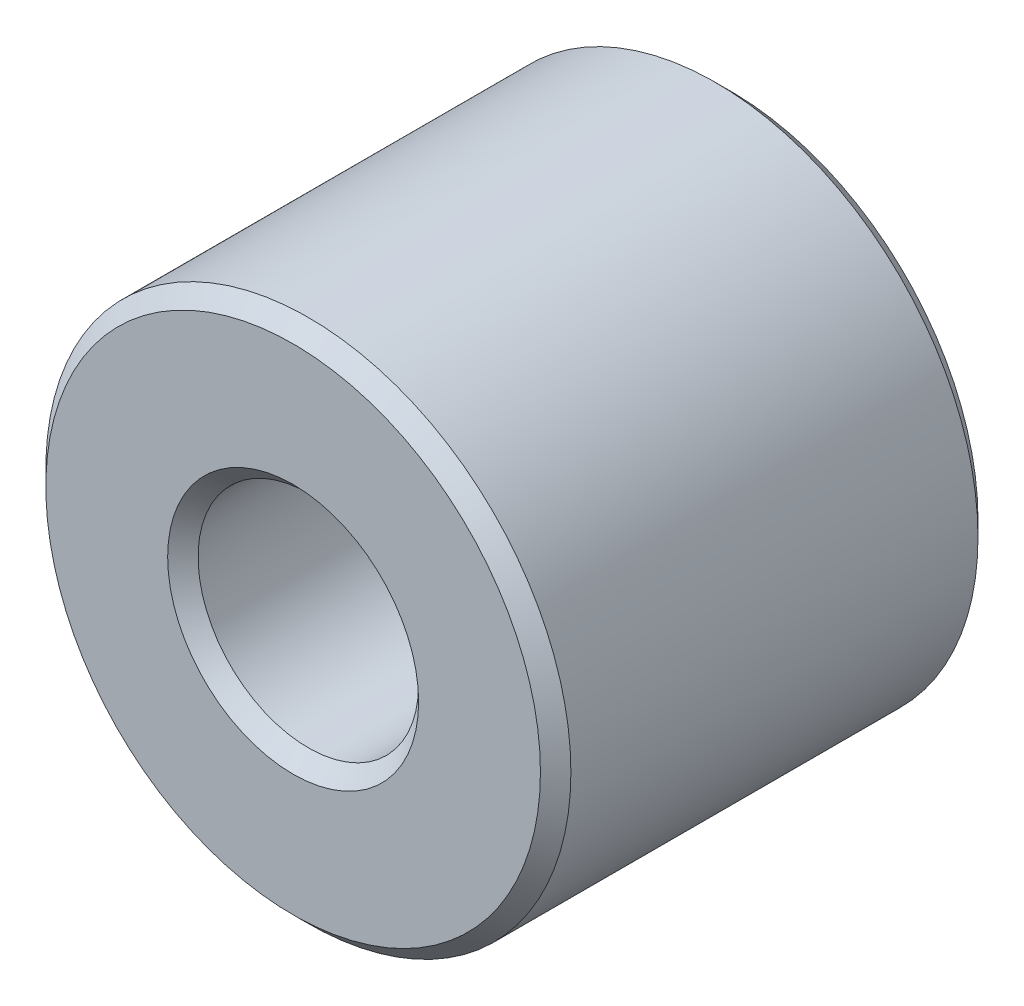
ISO-10303-21;
HEADER;
FILE_DESCRIPTION(('STEP AP214'),'2;1');
FILE_NAME('part.step','',(''),(''),'','','');
FILE_SCHEMA(('AUTOMOTIVE_DESIGN { 1 0 10303 214 1 1 1 1 }'));
ENDSEC;
DATA;
#1=APPLICATION_CONTEXT('core data for automotive mechanical design processes');
#2=APPLICATION_PROTOCOL_DEFINITION('international standard','automotive_design',2000,#1);
#3=PRODUCT_CONTEXT('',#1,'mechanical');
#4=PRODUCT('Part','Part','',(#3));
#5=PRODUCT_RELATED_PRODUCT_CATEGORY('part','',(#4));
#6=PRODUCT_DEFINITION_FORMATION('','',#4);
#7=PRODUCT_DEFINITION_CONTEXT('part definition',#1,'design');
#8=PRODUCT_DEFINITION('design','',#6,#7);
#9=PRODUCT_DEFINITION_SHAPE('','',#8);
#10=(LENGTH_UNIT() NAMED_UNIT(*) SI_UNIT(.MILLI.,.METRE.));
#11=(NAMED_UNIT(*) PLANE_ANGLE_UNIT() SI_UNIT($,.RADIAN.));
#12=(NAMED_UNIT(*) SI_UNIT($,.STERADIAN.) SOLID_ANGLE_UNIT());
#13=UNCERTAINTY_MEASURE_WITH_UNIT(LENGTH_MEASURE(1.E-05),#10,'distance_accuracy_value','');
#14=(GEOMETRIC_REPRESENTATION_CONTEXT(3) GLOBAL_UNCERTAINTY_ASSIGNED_CONTEXT((#13)) GLOBAL_UNIT_ASSIGNED_CONTEXT((#10,
#11,#12)) REPRESENTATION_CONTEXT('',''));
#15=CARTESIAN_POINT('',(0.,0.,0.));
#16=DIRECTION('',(0.,0.,1.));
#17=DIRECTION('',(1.,0.,0.));
#18=AXIS2_PLACEMENT_3D('',#15,#16,#17);
#19=CARTESIAN_POINT('',(0.,0.,-7.9375));
#20=DIRECTION('',(0.,0.,1.));
#21=DIRECTION('',(1.,0.,0.));
#22=AXIS2_PLACEMENT_3D('',#19,#20,#21);
#23=CYLINDRICAL_SURFACE('',#22,9.525);
#24=CARTESIAN_POINT('',(0.,0.,7.38504999999999));
#25=DIRECTION('',(0.,0.,1.));
#26=DIRECTION('',(1.,0.,0.));
#27=AXIS2_PLACEMENT_3D('',#24,#25,#26);
#28=CIRCLE('',#27,9.525);
#29=CARTESIAN_POINT('',(9.525,0.,7.38504999999999));
#30=VERTEX_POINT('',#29);
#31=EDGE_CURVE('E52',#30,#30,#28,.F.);
#32=ORIENTED_EDGE('',*,*,#31,.T.);
#33=EDGE_LOOP('',(#32));
#34=FACE_BOUND('',#33,.T.);
#35=CARTESIAN_POINT('',(0.,0.,-7.38505));
#36=DIRECTION('',(0.,0.,1.));
#37=DIRECTION('',(1.,0.,0.));
#38=AXIS2_PLACEMENT_3D('',#35,#36,#37);
#39=CIRCLE('',#38,9.525);
#40=CARTESIAN_POINT('',(9.525,0.,-7.38505));
#41=VERTEX_POINT('',#40);
#42=EDGE_CURVE('E55',#41,#41,#39,.T.);
#43=ORIENTED_EDGE('',*,*,#42,.T.);
#44=EDGE_LOOP('',(#43));
#45=FACE_BOUND('',#44,.T.);
#46=ADVANCED_FACE('F32',(#34,#45),#23,.T.);
#47=CARTESIAN_POINT('',(0.,0.,-7.9375));
#48=DIRECTION('',(0.,0.,1.));
#49=DIRECTION('',(1.,0.,0.));
#50=AXIS2_PLACEMENT_3D('',#47,#48,#49);
#51=PLANE('',#50);
#52=CARTESIAN_POINT('',(0.,0.,-7.9375));
#53=DIRECTION('',(0.,0.,1.));
#54=DIRECTION('',(1.,0.,0.));
#55=AXIS2_PLACEMENT_3D('',#52,#53,#54);
#56=CIRCLE('',#55,8.97255);
#57=CARTESIAN_POINT('',(8.97255,0.,-7.9375));
#58=VERTEX_POINT('',#57);
#59=EDGE_CURVE('E43',#58,#58,#56,.F.);
#60=ORIENTED_EDGE('',*,*,#59,.T.);
#61=EDGE_LOOP('',(#60));
#62=FACE_BOUND('',#61,.T.);
#63=CARTESIAN_POINT('',(0.,0.,-7.9375));
#64=DIRECTION('',(0.,0.,1.));
#65=DIRECTION('',(1.,0.,0.));
#66=AXIS2_PLACEMENT_3D('',#63,#64,#65);
#67=CIRCLE('',#66,4.55295);
#68=CARTESIAN_POINT('',(4.55295,0.,-7.9375));
#69=VERTEX_POINT('',#68);
#70=EDGE_CURVE('E47',#69,#69,#67,.T.);
#71=ORIENTED_EDGE('',*,*,#70,.T.);
#72=EDGE_LOOP('',(#71));
#73=FACE_BOUND('',#72,.T.);
#74=ADVANCED_FACE('F80',(#62,#73),#51,.F.);
#75=CARTESIAN_POINT('',(0.,0.,-7.9375));
#76=DIRECTION('',(0.,0.,1.));
#77=DIRECTION('',(1.,0.,0.));
#78=AXIS2_PLACEMENT_3D('',#75,#76,#77);
#79=CYLINDRICAL_SURFACE('',#78,4.0005);
#80=CARTESIAN_POINT('',(0.,0.,7.38505000000001));
#81=DIRECTION('',(0.,0.,1.));
#82=DIRECTION('',(1.,0.,0.));
#83=AXIS2_PLACEMENT_3D('',#80,#81,#82);
#84=CIRCLE('',#83,4.0005);
#85=CARTESIAN_POINT('',(4.0005,0.,7.38505000000001));
#86=VERTEX_POINT('',#85);
#87=EDGE_CURVE('E10',#86,#86,#84,.T.);
#88=ORIENTED_EDGE('',*,*,#87,.T.);
#89=EDGE_LOOP('',(#88));
#90=FACE_BOUND('',#89,.T.);
#91=CARTESIAN_POINT('',(0.,0.,-7.38505));
#92=DIRECTION('',(0.,0.,1.));
#93=DIRECTION('',(1.,0.,0.));
#94=AXIS2_PLACEMENT_3D('',#91,#92,#93);
#95=CIRCLE('',#94,4.0005);
#96=CARTESIAN_POINT('',(4.0005,0.,-7.38505));
#97=VERTEX_POINT('',#96);
#98=EDGE_CURVE('E39',#97,#97,#95,.F.);
#99=ORIENTED_EDGE('',*,*,#98,.T.);
#100=EDGE_LOOP('',(#99));
#101=FACE_BOUND('',#100,.T.);
#102=ADVANCED_FACE('F86',(#90,#101),#79,.F.);
#103=CARTESIAN_POINT('',(0.,0.,7.9375));
#104=DIRECTION('',(0.,0.,1.));
#105=DIRECTION('',(1.,0.,0.));
#106=AXIS2_PLACEMENT_3D('',#103,#104,#105);
#107=PLANE('',#106);
#108=CARTESIAN_POINT('',(0.,0.,7.9375));
#109=DIRECTION('',(0.,0.,1.));
#110=DIRECTION('',(1.,0.,0.));
#111=AXIS2_PLACEMENT_3D('',#108,#109,#110);
#112=CIRCLE('',#111,8.97255);
#113=CARTESIAN_POINT('',(8.97255,0.,7.9375));
#114=VERTEX_POINT('',#113);
#115=EDGE_CURVE('E58',#114,#114,#112,.T.);
#116=ORIENTED_EDGE('',*,*,#115,.T.);
#117=EDGE_LOOP('',(#116));
#118=FACE_BOUND('',#117,.T.);
#119=CARTESIAN_POINT('',(0.,0.,7.9375));
#120=DIRECTION('',(0.,0.,1.));
#121=DIRECTION('',(1.,0.,0.));
#122=AXIS2_PLACEMENT_3D('',#119,#120,#121);
#123=CIRCLE('',#122,4.55294999999999);
#124=CARTESIAN_POINT('',(4.55294999999999,0.,7.9375));
#125=VERTEX_POINT('',#124);
#126=EDGE_CURVE('E61',#125,#125,#123,.F.);
#127=ORIENTED_EDGE('',*,*,#126,.T.);
#128=EDGE_LOOP('',(#127));
#129=FACE_BOUND('',#128,.T.);
#130=ADVANCED_FACE('F65',(#118,#129),#107,.T.);
#131=CARTESIAN_POINT('',(0.,0.,7.9375));
#132=DIRECTION('',(0.,0.,-1.));
#133=DIRECTION('',(-1.,0.,0.));
#134=AXIS2_PLACEMENT_3D('',#131,#132,#133);
#135=CONICAL_SURFACE('',#134,8.97255,0.785398163397442);
#136=ORIENTED_EDGE('',*,*,#31,.F.);
#137=EDGE_LOOP('',(#136));
#138=FACE_BOUND('',#137,.T.);
#139=ORIENTED_EDGE('',*,*,#115,.F.);
#140=EDGE_LOOP('',(#139));
#141=FACE_BOUND('',#140,.T.);
#142=ADVANCED_FACE('F76',(#138,#141),#135,.T.);
#143=CARTESIAN_POINT('',(0.,0.,-7.38505));
#144=DIRECTION('',(0.,0.,1.));
#145=DIRECTION('',(1.,0.,0.));
#146=AXIS2_PLACEMENT_3D('',#143,#144,#145);
#147=CONICAL_SURFACE('',#146,9.525,0.785398163397447);
#148=ORIENTED_EDGE('',*,*,#59,.F.);
#149=EDGE_LOOP('',(#148));
#150=FACE_BOUND('',#149,.T.);
#151=ORIENTED_EDGE('',*,*,#42,.F.);
#152=EDGE_LOOP('',(#151));
#153=FACE_BOUND('',#152,.T.);
#154=ADVANCED_FACE('F70',(#150,#153),#147,.T.);
#155=CARTESIAN_POINT('',(0.,0.,7.38505000000001));
#156=DIRECTION('',(0.,0.,1.));
#157=DIRECTION('',(1.,0.,0.));
#158=AXIS2_PLACEMENT_3D('',#155,#156,#157);
#159=CONICAL_SURFACE('',#158,4.0005,0.785398163397451);
#160=ORIENTED_EDGE('',*,*,#126,.F.);
#161=EDGE_LOOP('',(#160));
#162=FACE_BOUND('',#161,.T.);
#163=ORIENTED_EDGE('',*,*,#87,.F.);
#164=EDGE_LOOP('',(#163));
#165=FACE_BOUND('',#164,.T.);
#166=ADVANCED_FACE('F67',(#162,#165),#159,.F.);
#167=CARTESIAN_POINT('',(0.,0.,-7.9375));
#168=DIRECTION('',(0.,0.,-1.));
#169=DIRECTION('',(-1.,0.,0.));
#170=AXIS2_PLACEMENT_3D('',#167,#168,#169);
#171=CONICAL_SURFACE('',#170,4.55295,0.785398163397443);
#172=ORIENTED_EDGE('',*,*,#98,.F.);
#173=EDGE_LOOP('',(#172));
#174=FACE_BOUND('',#173,.T.);
#175=ORIENTED_EDGE('',*,*,#70,.F.);
#176=EDGE_LOOP('',(#175));
#177=FACE_BOUND('',#176,.T.);
#178=ADVANCED_FACE('F34',(#174,#177),#171,.F.);
#179=CLOSED_SHELL('',(#46,#74,#102,#130,#142,#154,#166,#178));
#180=MANIFOLD_SOLID_BREP('B2',#179);
#181=ADVANCED_BREP_SHAPE_REPRESENTATION('',(#18,#180),#14);
#182=SHAPE_DEFINITION_REPRESENTATION(#9,#181);
ENDSEC;
END-ISO-10303-21;
